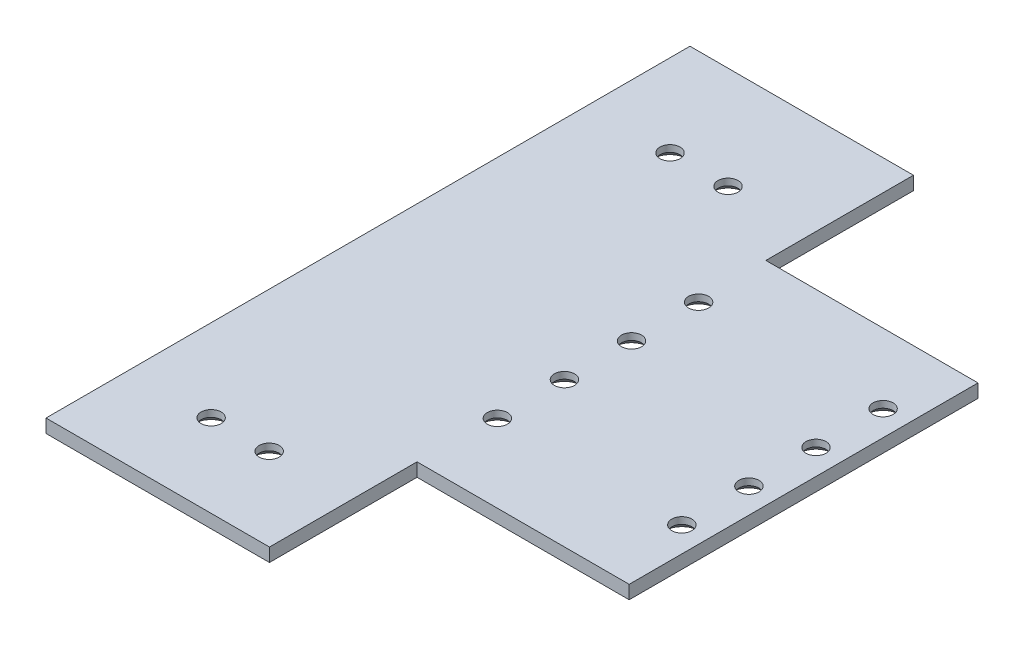
ISO-10303-21;
HEADER;
FILE_DESCRIPTION(('STEP AP214'),'2;1');
FILE_NAME('part.step','',(''),(''),'','','');
FILE_SCHEMA(('AUTOMOTIVE_DESIGN { 1 0 10303 214 1 1 1 1 }'));
ENDSEC;
DATA;
#1=APPLICATION_CONTEXT('core data for automotive mechanical design processes');
#2=APPLICATION_PROTOCOL_DEFINITION('international standard','automotive_design',2000,#1);
#3=PRODUCT_CONTEXT('',#1,'mechanical');
#4=PRODUCT('Part','Part','',(#3));
#5=PRODUCT_RELATED_PRODUCT_CATEGORY('part','',(#4));
#6=PRODUCT_DEFINITION_FORMATION('','',#4);
#7=PRODUCT_DEFINITION_CONTEXT('part definition',#1,'design');
#8=PRODUCT_DEFINITION('design','',#6,#7);
#9=PRODUCT_DEFINITION_SHAPE('','',#8);
#10=(LENGTH_UNIT() NAMED_UNIT(*) SI_UNIT(.MILLI.,.METRE.));
#11=(NAMED_UNIT(*) PLANE_ANGLE_UNIT() SI_UNIT($,.RADIAN.));
#12=(NAMED_UNIT(*) SI_UNIT($,.STERADIAN.) SOLID_ANGLE_UNIT());
#13=UNCERTAINTY_MEASURE_WITH_UNIT(LENGTH_MEASURE(1.E-05),#10,'distance_accuracy_value','');
#14=(GEOMETRIC_REPRESENTATION_CONTEXT(3) GLOBAL_UNCERTAINTY_ASSIGNED_CONTEXT((#13)) GLOBAL_UNIT_ASSIGNED_CONTEXT((#10,
#11,#12)) REPRESENTATION_CONTEXT('',''));
#15=CARTESIAN_POINT('',(0.,0.,0.));
#16=DIRECTION('',(0.,0.,1.));
#17=DIRECTION('',(1.,0.,0.));
#18=AXIS2_PLACEMENT_3D('',#15,#16,#17);
#19=CARTESIAN_POINT('',(0.,2.,0.));
#20=DIRECTION('',(0.,-1.,0.));
#21=DIRECTION('',(0.,0.,-1.));
#22=AXIS2_PLACEMENT_3D('',#19,#20,#21);
#23=PLANE('',#22);
#24=CARTESIAN_POINT('',(5.92356900920418,2.,35.6602207894241));
#25=DIRECTION('',(0.,1.,0.));
#26=DIRECTION('',(0.,0.,1.));
#27=AXIS2_PLACEMENT_3D('',#24,#25,#26);
#28=CIRCLE('',#27,1.5);
#29=CARTESIAN_POINT('',(5.92356900920418,2.,37.1602207894241));
#30=VERTEX_POINT('',#29);
#31=EDGE_CURVE('E350',#30,#30,#28,.T.);
#32=ORIENTED_EDGE('',*,*,#31,.F.);
#33=EDGE_LOOP('',(#32));
#34=FACE_BOUND('',#33,.T.);
#35=CARTESIAN_POINT('',(-2.72643099079582,2.,35.6602207894241));
#36=DIRECTION('',(0.,1.,0.));
#37=DIRECTION('',(0.,0.,1.));
#38=AXIS2_PLACEMENT_3D('',#35,#36,#37);
#39=CIRCLE('',#38,1.5);
#40=CARTESIAN_POINT('',(-2.72643099079582,2.,37.1602207894241));
#41=VERTEX_POINT('',#40);
#42=EDGE_CURVE('E348',#41,#41,#39,.T.);
#43=ORIENTED_EDGE('',*,*,#42,.F.);
#44=EDGE_LOOP('',(#43));
#45=FACE_BOUND('',#44,.T.);
#46=CARTESIAN_POINT('',(-2.72643099079582,2.,-32.7469767878305));
#47=DIRECTION('',(0.,1.,0.));
#48=DIRECTION('',(0.,0.,1.));
#49=AXIS2_PLACEMENT_3D('',#46,#47,#48);
#50=CIRCLE('',#49,1.5);
#51=CARTESIAN_POINT('',(-2.72643099079582,2.,-31.2469767878306));
#52=VERTEX_POINT('',#51);
#53=EDGE_CURVE('E349',#52,#52,#50,.T.);
#54=ORIENTED_EDGE('',*,*,#53,.F.);
#55=EDGE_LOOP('',(#54));
#56=FACE_BOUND('',#55,.T.);
#57=CARTESIAN_POINT('',(5.92356900920418,2.,-32.7469767878305));
#58=DIRECTION('',(0.,1.,0.));
#59=DIRECTION('',(0.,0.,1.));
#60=AXIS2_PLACEMENT_3D('',#57,#58,#59);
#61=CIRCLE('',#60,1.5);
#62=CARTESIAN_POINT('',(5.92356900920418,2.,-31.2469767878306));
#63=VERTEX_POINT('',#62);
#64=EDGE_CURVE('E353',#63,#63,#61,.T.);
#65=ORIENTED_EDGE('',*,*,#64,.F.);
#66=EDGE_LOOP('',(#65));
#67=FACE_BOUND('',#66,.T.);
#68=CARTESIAN_POINT('',(46.1837979810975,2.,-5.59999999995909));
#69=DIRECTION('',(0.,1.,0.));
#70=DIRECTION('',(0.,0.,1.));
#71=AXIS2_PLACEMENT_3D('',#68,#69,#70);
#72=CIRCLE('',#71,1.50000000001881);
#73=CARTESIAN_POINT('',(46.1837979810975,2.,-4.09999999994028));
#74=VERTEX_POINT('',#73);
#75=EDGE_CURVE('E369',#74,#74,#72,.T.);
#76=ORIENTED_EDGE('',*,*,#75,.F.);
#77=EDGE_LOOP('',(#76));
#78=FACE_BOUND('',#77,.T.);
#79=CARTESIAN_POINT('',(18.6837979810975,2.,4.40000000004091));
#80=DIRECTION('',(0.,1.,0.));
#81=DIRECTION('',(0.,0.,1.));
#82=AXIS2_PLACEMENT_3D('',#79,#80,#81);
#83=CIRCLE('',#82,1.50000000001833);
#84=CARTESIAN_POINT('',(18.6837979810975,2.,5.90000000005924));
#85=VERTEX_POINT('',#84);
#86=EDGE_CURVE('E372',#85,#85,#83,.T.);
#87=ORIENTED_EDGE('',*,*,#86,.F.);
#88=EDGE_LOOP('',(#87));
#89=FACE_BOUND('',#88,.T.);
#90=CARTESIAN_POINT('',(46.1837979810975,2.,4.40000000004091));
#91=DIRECTION('',(0.,1.,0.));
#92=DIRECTION('',(0.,0.,1.));
#93=AXIS2_PLACEMENT_3D('',#90,#91,#92);
#94=CIRCLE('',#93,1.50000000001881);
#95=CARTESIAN_POINT('',(46.1837979810975,2.,5.90000000005972));
#96=VERTEX_POINT('',#95);
#97=EDGE_CURVE('E375',#96,#96,#94,.T.);
#98=ORIENTED_EDGE('',*,*,#97,.F.);
#99=EDGE_LOOP('',(#98));
#100=FACE_BOUND('',#99,.T.);
#101=CARTESIAN_POINT('',(18.6837979810975,2.,14.4000000000409));
#102=DIRECTION('',(0.,1.,0.));
#103=DIRECTION('',(0.,0.,1.));
#104=AXIS2_PLACEMENT_3D('',#101,#102,#103);
#105=CIRCLE('',#104,1.50000000001833);
#106=CARTESIAN_POINT('',(18.6837979810975,2.,15.9000000000592));
#107=VERTEX_POINT('',#106);
#108=EDGE_CURVE('E378',#107,#107,#105,.T.);
#109=ORIENTED_EDGE('',*,*,#108,.F.);
#110=EDGE_LOOP('',(#109));
#111=FACE_BOUND('',#110,.T.);
#112=CARTESIAN_POINT('',(18.6837979810974,2.,-15.5999999999591));
#113=DIRECTION('',(0.,1.,0.));
#114=DIRECTION('',(0.,0.,1.));
#115=AXIS2_PLACEMENT_3D('',#112,#113,#114);
#116=CIRCLE('',#115,1.50000000001833);
#117=CARTESIAN_POINT('',(18.6837979810974,2.,-14.0999999999408));
#118=VERTEX_POINT('',#117);
#119=EDGE_CURVE('E362',#118,#118,#116,.T.);
#120=ORIENTED_EDGE('',*,*,#119,.F.);
#121=EDGE_LOOP('',(#120));
#122=FACE_BOUND('',#121,.T.);
#123=CARTESIAN_POINT('',(46.1837979810974,2.,-15.5999999999591));
#124=DIRECTION('',(0.,1.,0.));
#125=DIRECTION('',(0.,0.,1.));
#126=AXIS2_PLACEMENT_3D('',#123,#124,#125);
#127=CIRCLE('',#126,1.50000000001881);
#128=CARTESIAN_POINT('',(46.1837979810974,2.,-14.0999999999403));
#129=VERTEX_POINT('',#128);
#130=EDGE_CURVE('E365',#129,#129,#127,.T.);
#131=ORIENTED_EDGE('',*,*,#130,.F.);
#132=EDGE_LOOP('',(#131));
#133=FACE_BOUND('',#132,.T.);
#134=CARTESIAN_POINT('',(18.6837979810975,2.,-5.59999999995909));
#135=DIRECTION('',(0.,1.,0.));
#136=DIRECTION('',(0.,0.,1.));
#137=AXIS2_PLACEMENT_3D('',#134,#135,#136);
#138=CIRCLE('',#137,1.50000000001833);
#139=CARTESIAN_POINT('',(18.6837979810975,2.,-4.09999999994076));
#140=VERTEX_POINT('',#139);
#141=EDGE_CURVE('E366',#140,#140,#138,.T.);
#142=ORIENTED_EDGE('',*,*,#141,.F.);
#143=EDGE_LOOP('',(#142));
#144=FACE_BOUND('',#143,.T.);
#145=CARTESIAN_POINT('',(46.1837979810975,2.,14.4000000000409));
#146=DIRECTION('',(0.,1.,0.));
#147=DIRECTION('',(0.,0.,1.));
#148=AXIS2_PLACEMENT_3D('',#145,#146,#147);
#149=CIRCLE('',#148,1.50000000001881);
#150=CARTESIAN_POINT('',(46.1837979810975,2.,15.9000000000597));
#151=VERTEX_POINT('',#150);
#152=EDGE_CURVE('E142',#151,#151,#149,.T.);
#153=ORIENTED_EDGE('',*,*,#152,.F.);
#154=EDGE_LOOP('',(#153));
#155=FACE_BOUND('',#154,.T.);
#156=DIRECTION('',(-1.,0.,0.));
#157=VECTOR('',#156,1.);
#158=CARTESIAN_POINT('',(15.,2.,-47.999999999969));
#159=LINE('',#158,#157);
#160=CARTESIAN_POINT('',(18.309932440846,2.,-47.999999999969));
#161=VERTEX_POINT('',#160);
#162=CARTESIAN_POINT('',(-15.0020752239317,2.,-47.999999999969));
#163=VERTEX_POINT('',#162);
#164=EDGE_CURVE('E133',#161,#163,#159,.T.);
#165=ORIENTED_EDGE('',*,*,#164,.T.);
#166=DIRECTION('',(0.,0.,-1.));
#167=VECTOR('',#166,1.);
#168=CARTESIAN_POINT('',(-15.0020752239318,2.,-47.999999999969));
#169=LINE('',#168,#167);
#170=CARTESIAN_POINT('',(-15.0020752239317,2.,47.9999999999896));
#171=VERTEX_POINT('',#170);
#172=EDGE_CURVE('E55',#171,#163,#169,.T.);
#173=ORIENTED_EDGE('',*,*,#172,.F.);
#174=DIRECTION('',(1.,0.,1.61649475190916E-13));
#175=VECTOR('',#174,1.);
#176=CARTESIAN_POINT('',(-48.9590812442226,2.,48.000000000031));
#177=LINE('',#176,#175);
#178=CARTESIAN_POINT('',(18.309932440846,2.,48.0000000000413));
#179=VERTEX_POINT('',#178);
#180=EDGE_CURVE('E99',#171,#179,#177,.T.);
#181=ORIENTED_EDGE('',*,*,#180,.T.);
#182=DIRECTION('',(0.,0.,-1.));
#183=VECTOR('',#182,1.);
#184=CARTESIAN_POINT('',(18.309932440846,2.,26.0000000000413));
#185=LINE('',#184,#183);
#186=CARTESIAN_POINT('',(18.309932440846,2.,26.0000000000413));
#187=VERTEX_POINT('',#186);
#188=EDGE_CURVE('E386',#179,#187,#185,.T.);
#189=ORIENTED_EDGE('',*,*,#188,.T.);
#190=DIRECTION('',(1.,0.,0.));
#191=VECTOR('',#190,1.);
#192=CARTESIAN_POINT('',(49.9337979810974,2.,26.0000000000413));
#193=LINE('',#192,#191);
#194=CARTESIAN_POINT('',(49.9337979810974,2.,26.0000000000413));
#195=VERTEX_POINT('',#194);
#196=EDGE_CURVE('E115',#187,#195,#193,.T.);
#197=ORIENTED_EDGE('',*,*,#196,.T.);
#198=DIRECTION('',(0.,0.,-1.));
#199=VECTOR('',#198,1.);
#200=CARTESIAN_POINT('',(49.9337979810974,2.,-25.999999999969));
#201=LINE('',#200,#199);
#202=CARTESIAN_POINT('',(49.9337979810974,2.,-25.999999999969));
#203=VERTEX_POINT('',#202);
#204=EDGE_CURVE('E109',#195,#203,#201,.T.);
#205=ORIENTED_EDGE('',*,*,#204,.T.);
#206=DIRECTION('',(-1.,0.,0.));
#207=VECTOR('',#206,1.);
#208=CARTESIAN_POINT('',(49.9337979810974,2.,-25.999999999969));
#209=LINE('',#208,#207);
#210=CARTESIAN_POINT('',(18.309932440846,2.,-25.999999999969));
#211=VERTEX_POINT('',#210);
#212=EDGE_CURVE('E112',#203,#211,#209,.T.);
#213=ORIENTED_EDGE('',*,*,#212,.T.);
#214=DIRECTION('',(0.,0.,-1.));
#215=VECTOR('',#214,1.);
#216=CARTESIAN_POINT('',(18.309932440846,2.,-25.999999999969));
#217=LINE('',#216,#215);
#218=EDGE_CURVE('E64',#211,#161,#217,.T.);
#219=ORIENTED_EDGE('',*,*,#218,.T.);
#220=EDGE_LOOP('',(#165,#173,#181,#189,#197,#205,#213,#219));
#221=FACE_BOUND('',#220,.T.);
#222=ADVANCED_FACE('F39',(#34,#45,#56,#67,#78,#89,#100,#111,#122,#133,#144,#155,#221),#23,.F.);
#223=CARTESIAN_POINT('',(0.,0.,0.));
#224=DIRECTION('',(0.,-1.,0.));
#225=DIRECTION('',(0.,0.,-1.));
#226=AXIS2_PLACEMENT_3D('',#223,#224,#225);
#227=PLANE('',#226);
#228=CARTESIAN_POINT('',(-2.72643099079582,0.,35.6602207894241));
#229=DIRECTION('',(0.,-1.,0.));
#230=DIRECTION('',(0.,0.,-1.));
#231=AXIS2_PLACEMENT_3D('',#228,#229,#230);
#232=CIRCLE('',#231,2.50000000000002);
#233=CARTESIAN_POINT('',(-2.72643099079582,0.,33.1602207894241));
#234=VERTEX_POINT('',#233);
#235=EDGE_CURVE('E222',#234,#234,#232,.F.);
#236=ORIENTED_EDGE('',*,*,#235,.T.);
#237=EDGE_LOOP('',(#236));
#238=FACE_BOUND('',#237,.T.);
#239=CARTESIAN_POINT('',(5.92356900920418,0.,35.6602207894241));
#240=DIRECTION('',(0.,-1.,0.));
#241=DIRECTION('',(0.,0.,-1.));
#242=AXIS2_PLACEMENT_3D('',#239,#240,#241);
#243=CIRCLE('',#242,2.50000000000002);
#244=CARTESIAN_POINT('',(5.92356900920418,0.,33.1602207894241));
#245=VERTEX_POINT('',#244);
#246=EDGE_CURVE('E219',#245,#245,#243,.F.);
#247=ORIENTED_EDGE('',*,*,#246,.T.);
#248=EDGE_LOOP('',(#247));
#249=FACE_BOUND('',#248,.T.);
#250=CARTESIAN_POINT('',(-2.72643099079582,0.,-32.7469767878305));
#251=DIRECTION('',(0.,-1.,0.));
#252=DIRECTION('',(0.,0.,-1.));
#253=AXIS2_PLACEMENT_3D('',#250,#251,#252);
#254=CIRCLE('',#253,2.50000000000002);
#255=CARTESIAN_POINT('',(-2.72643099079582,0.,-35.2469767878306));
#256=VERTEX_POINT('',#255);
#257=EDGE_CURVE('E216',#256,#256,#254,.F.);
#258=ORIENTED_EDGE('',*,*,#257,.T.);
#259=EDGE_LOOP('',(#258));
#260=FACE_BOUND('',#259,.T.);
#261=CARTESIAN_POINT('',(5.92356900920418,0.,-32.7469767878305));
#262=DIRECTION('',(0.,-1.,0.));
#263=DIRECTION('',(0.,0.,-1.));
#264=AXIS2_PLACEMENT_3D('',#261,#262,#263);
#265=CIRCLE('',#264,2.50000000000002);
#266=CARTESIAN_POINT('',(5.92356900920418,0.,-35.2469767878306));
#267=VERTEX_POINT('',#266);
#268=EDGE_CURVE('E213',#267,#267,#265,.F.);
#269=ORIENTED_EDGE('',*,*,#268,.T.);
#270=EDGE_LOOP('',(#269));
#271=FACE_BOUND('',#270,.T.);
#272=DIRECTION('',(0.,0.,1.));
#273=VECTOR('',#272,1.);
#274=CARTESIAN_POINT('',(-15.0020752239317,0.,0.));
#275=LINE('',#274,#273);
#276=CARTESIAN_POINT('',(-15.0020752239318,0.,-47.999999999969));
#277=VERTEX_POINT('',#276);
#278=CARTESIAN_POINT('',(-15.0020752239317,0.,47.9999999999896));
#279=VERTEX_POINT('',#278);
#280=EDGE_CURVE('E356',#277,#279,#275,.T.);
#281=ORIENTED_EDGE('',*,*,#280,.F.);
#282=DIRECTION('',(-1.,0.,1.61866454352247E-13));
#283=VECTOR('',#282,1.);
#284=CARTESIAN_POINT('',(-48.9590812442226,0.,-47.9999999999586));
#285=LINE('',#284,#283);
#286=CARTESIAN_POINT('',(18.309932440846,0.,-47.999999999969));
#287=VERTEX_POINT('',#286);
#288=EDGE_CURVE('E92',#287,#277,#285,.T.);
#289=ORIENTED_EDGE('',*,*,#288,.F.);
#290=DIRECTION('',(0.,0.,-1.));
#291=VECTOR('',#290,1.);
#292=CARTESIAN_POINT('',(18.309932440846,0.,-25.999999999969));
#293=LINE('',#292,#291);
#294=CARTESIAN_POINT('',(18.309932440846,0.,-25.999999999969));
#295=VERTEX_POINT('',#294);
#296=EDGE_CURVE('E149',#295,#287,#293,.T.);
#297=ORIENTED_EDGE('',*,*,#296,.F.);
#298=DIRECTION('',(-1.,0.,0.));
#299=VECTOR('',#298,1.);
#300=CARTESIAN_POINT('',(49.9337979810974,0.,-25.999999999969));
#301=LINE('',#300,#299);
#302=CARTESIAN_POINT('',(49.9337979810974,0.,-25.999999999969));
#303=VERTEX_POINT('',#302);
#304=EDGE_CURVE('E147',#303,#295,#301,.T.);
#305=ORIENTED_EDGE('',*,*,#304,.F.);
#306=DIRECTION('',(0.,0.,-1.));
#307=VECTOR('',#306,1.);
#308=CARTESIAN_POINT('',(49.9337979810974,0.,-25.999999999969));
#309=LINE('',#308,#307);
#310=CARTESIAN_POINT('',(49.9337979810974,0.,26.0000000000413));
#311=VERTEX_POINT('',#310);
#312=EDGE_CURVE('E124',#311,#303,#309,.T.);
#313=ORIENTED_EDGE('',*,*,#312,.F.);
#314=DIRECTION('',(1.,0.,0.));
#315=VECTOR('',#314,1.);
#316=CARTESIAN_POINT('',(49.9337979810974,0.,26.0000000000413));
#317=LINE('',#316,#315);
#318=CARTESIAN_POINT('',(18.309932440846,0.,26.0000000000413));
#319=VERTEX_POINT('',#318);
#320=EDGE_CURVE('E144',#319,#311,#317,.T.);
#321=ORIENTED_EDGE('',*,*,#320,.F.);
#322=DIRECTION('',(0.,0.,-1.));
#323=VECTOR('',#322,1.);
#324=CARTESIAN_POINT('',(18.309932440846,0.,26.0000000000413));
#325=LINE('',#324,#323);
#326=CARTESIAN_POINT('',(18.309932440846,0.,48.0000000000413));
#327=VERTEX_POINT('',#326);
#328=EDGE_CURVE('E141',#327,#319,#325,.T.);
#329=ORIENTED_EDGE('',*,*,#328,.F.);
#330=DIRECTION('',(1.,0.,0.));
#331=VECTOR('',#330,1.);
#332=CARTESIAN_POINT('',(15.,0.,48.0000000000413));
#333=LINE('',#332,#331);
#334=EDGE_CURVE('E139',#279,#327,#333,.T.);
#335=ORIENTED_EDGE('',*,*,#334,.F.);
#336=EDGE_LOOP('',(#281,#289,#297,#305,#313,#321,#329,#335));
#337=FACE_BOUND('',#336,.T.);
#338=CARTESIAN_POINT('',(18.6837979810974,0.,-15.5999999999591));
#339=DIRECTION('',(0.,-1.,0.));
#340=DIRECTION('',(0.,0.,-1.));
#341=AXIS2_PLACEMENT_3D('',#338,#339,#340);
#342=CIRCLE('',#341,2.50000000001835);
#343=CARTESIAN_POINT('',(18.6837979810974,0.,-18.0999999999774));
#344=VERTEX_POINT('',#343);
#345=EDGE_CURVE('E186',#344,#344,#342,.F.);
#346=ORIENTED_EDGE('',*,*,#345,.T.);
#347=EDGE_LOOP('',(#346));
#348=FACE_BOUND('',#347,.T.);
#349=CARTESIAN_POINT('',(18.6837979810975,0.,-5.59999999995909));
#350=DIRECTION('',(0.,-1.,0.));
#351=DIRECTION('',(0.,0.,-1.));
#352=AXIS2_PLACEMENT_3D('',#349,#350,#351);
#353=CIRCLE('',#352,2.50000000001835);
#354=CARTESIAN_POINT('',(18.6837979810975,0.,-8.09999999997744));
#355=VERTEX_POINT('',#354);
#356=EDGE_CURVE('E183',#355,#355,#353,.F.);
#357=ORIENTED_EDGE('',*,*,#356,.T.);
#358=EDGE_LOOP('',(#357));
#359=FACE_BOUND('',#358,.T.);
#360=CARTESIAN_POINT('',(18.6837979810975,0.,4.40000000004091));
#361=DIRECTION('',(0.,-1.,0.));
#362=DIRECTION('',(0.,0.,-1.));
#363=AXIS2_PLACEMENT_3D('',#360,#361,#362);
#364=CIRCLE('',#363,2.50000000001835);
#365=CARTESIAN_POINT('',(18.6837979810975,0.,1.90000000002256));
#366=VERTEX_POINT('',#365);
#367=EDGE_CURVE('E180',#366,#366,#364,.F.);
#368=ORIENTED_EDGE('',*,*,#367,.T.);
#369=EDGE_LOOP('',(#368));
#370=FACE_BOUND('',#369,.T.);
#371=CARTESIAN_POINT('',(18.6837979810975,0.,14.4000000000409));
#372=DIRECTION('',(0.,-1.,0.));
#373=DIRECTION('',(0.,0.,-1.));
#374=AXIS2_PLACEMENT_3D('',#371,#372,#373);
#375=CIRCLE('',#374,2.50000000001835);
#376=CARTESIAN_POINT('',(18.6837979810975,0.,11.9000000000226));
#377=VERTEX_POINT('',#376);
#378=EDGE_CURVE('E177',#377,#377,#375,.F.);
#379=ORIENTED_EDGE('',*,*,#378,.T.);
#380=EDGE_LOOP('',(#379));
#381=FACE_BOUND('',#380,.T.);
#382=CARTESIAN_POINT('',(46.1837979810974,0.,-15.5999999999591));
#383=DIRECTION('',(0.,-1.,0.));
#384=DIRECTION('',(0.,0.,-1.));
#385=AXIS2_PLACEMENT_3D('',#382,#383,#384);
#386=CIRCLE('',#385,2.50000000001882);
#387=CARTESIAN_POINT('',(46.1837979810974,0.,-18.0999999999779));
#388=VERTEX_POINT('',#387);
#389=EDGE_CURVE('E174',#388,#388,#386,.F.);
#390=ORIENTED_EDGE('',*,*,#389,.T.);
#391=EDGE_LOOP('',(#390));
#392=FACE_BOUND('',#391,.T.);
#393=CARTESIAN_POINT('',(46.1837979810975,0.,-5.59999999995909));
#394=DIRECTION('',(0.,-1.,0.));
#395=DIRECTION('',(0.,0.,-1.));
#396=AXIS2_PLACEMENT_3D('',#393,#394,#395);
#397=CIRCLE('',#396,2.50000000001883);
#398=CARTESIAN_POINT('',(46.1837979810975,0.,-8.09999999997792));
#399=VERTEX_POINT('',#398);
#400=EDGE_CURVE('E171',#399,#399,#397,.F.);
#401=ORIENTED_EDGE('',*,*,#400,.T.);
#402=EDGE_LOOP('',(#401));
#403=FACE_BOUND('',#402,.T.);
#404=CARTESIAN_POINT('',(46.1837979810975,0.,4.40000000004091));
#405=DIRECTION('',(0.,-1.,0.));
#406=DIRECTION('',(0.,0.,-1.));
#407=AXIS2_PLACEMENT_3D('',#404,#405,#406);
#408=CIRCLE('',#407,2.50000000001882);
#409=CARTESIAN_POINT('',(46.1837979810975,0.,1.90000000002208));
#410=VERTEX_POINT('',#409);
#411=EDGE_CURVE('E168',#410,#410,#408,.F.);
#412=ORIENTED_EDGE('',*,*,#411,.T.);
#413=EDGE_LOOP('',(#412));
#414=FACE_BOUND('',#413,.T.);
#415=CARTESIAN_POINT('',(46.1837979810975,0.,14.4000000000409));
#416=DIRECTION('',(0.,-1.,0.));
#417=DIRECTION('',(0.,0.,-1.));
#418=AXIS2_PLACEMENT_3D('',#415,#416,#417);
#419=CIRCLE('',#418,2.50000000001882);
#420=CARTESIAN_POINT('',(46.1837979810975,0.,11.9000000000221));
#421=VERTEX_POINT('',#420);
#422=EDGE_CURVE('E165',#421,#421,#419,.F.);
#423=ORIENTED_EDGE('',*,*,#422,.T.);
#424=EDGE_LOOP('',(#423));
#425=FACE_BOUND('',#424,.T.);
#426=ADVANCED_FACE('F248',(#238,#249,#260,#271,#337,#348,#359,#370,#381,#392,#403,#414,#425),
#227,.T.);
#427=CARTESIAN_POINT('',(15.,2.,48.0000000000413));
#428=DIRECTION('',(0.,0.,-1.));
#429=DIRECTION('',(-1.,0.,0.));
#430=AXIS2_PLACEMENT_3D('',#427,#428,#429);
#431=PLANE('',#430);
#432=ORIENTED_EDGE('',*,*,#180,.F.);
#433=DIRECTION('',(0.,1.,0.));
#434=VECTOR('',#433,1.);
#435=CARTESIAN_POINT('',(-15.0020752239317,-8.,47.9999999999896));
#436=LINE('',#435,#434);
#437=EDGE_CURVE('E399',#279,#171,#436,.T.);
#438=ORIENTED_EDGE('',*,*,#437,.F.);
#439=ORIENTED_EDGE('',*,*,#334,.T.);
#440=DIRECTION('',(0.,-1.,0.));
#441=VECTOR('',#440,1.);
#442=CARTESIAN_POINT('',(18.309932440846,2.,48.0000000000413));
#443=LINE('',#442,#441);
#444=EDGE_CURVE('E159',#179,#327,#443,.T.);
#445=ORIENTED_EDGE('',*,*,#444,.F.);
#446=EDGE_LOOP('',(#432,#438,#439,#445));
#447=FACE_BOUND('',#446,.T.);
#448=ADVANCED_FACE('F254',(#447),#431,.F.);
#449=CARTESIAN_POINT('',(18.309932440846,2.,26.0000000000413));
#450=DIRECTION('',(-1.,0.,0.));
#451=DIRECTION('',(0.,0.,1.));
#452=AXIS2_PLACEMENT_3D('',#449,#450,#451);
#453=PLANE('',#452);
#454=ORIENTED_EDGE('',*,*,#328,.T.);
#455=DIRECTION('',(0.,-1.,0.));
#456=VECTOR('',#455,1.);
#457=CARTESIAN_POINT('',(18.309932440846,2.,26.0000000000413));
#458=LINE('',#457,#456);
#459=EDGE_CURVE('E156',#187,#319,#458,.T.);
#460=ORIENTED_EDGE('',*,*,#459,.F.);
#461=ORIENTED_EDGE('',*,*,#188,.F.);
#462=ORIENTED_EDGE('',*,*,#444,.T.);
#463=EDGE_LOOP('',(#454,#460,#461,#462));
#464=FACE_BOUND('',#463,.T.);
#465=ADVANCED_FACE('F278',(#464),#453,.F.);
#466=CARTESIAN_POINT('',(49.9337979810974,2.,26.0000000000413));
#467=DIRECTION('',(0.,0.,-1.));
#468=DIRECTION('',(-1.,0.,0.));
#469=AXIS2_PLACEMENT_3D('',#466,#467,#468);
#470=PLANE('',#469);
#471=ORIENTED_EDGE('',*,*,#320,.T.);
#472=DIRECTION('',(0.,-1.,0.));
#473=VECTOR('',#472,1.);
#474=CARTESIAN_POINT('',(49.9337979810974,2.,26.0000000000413));
#475=LINE('',#474,#473);
#476=EDGE_CURVE('E127',#195,#311,#475,.T.);
#477=ORIENTED_EDGE('',*,*,#476,.F.);
#478=ORIENTED_EDGE('',*,*,#196,.F.);
#479=ORIENTED_EDGE('',*,*,#459,.T.);
#480=EDGE_LOOP('',(#471,#477,#478,#479));
#481=FACE_BOUND('',#480,.T.);
#482=ADVANCED_FACE('F275',(#481),#470,.F.);
#483=CARTESIAN_POINT('',(49.9337979810974,2.,-25.999999999969));
#484=DIRECTION('',(-1.,0.,0.));
#485=DIRECTION('',(0.,0.,1.));
#486=AXIS2_PLACEMENT_3D('',#483,#484,#485);
#487=PLANE('',#486);
#488=ORIENTED_EDGE('',*,*,#312,.T.);
#489=DIRECTION('',(0.,-1.,0.));
#490=VECTOR('',#489,1.);
#491=CARTESIAN_POINT('',(49.9337979810974,2.,-25.999999999969));
#492=LINE('',#491,#490);
#493=EDGE_CURVE('E121',#203,#303,#492,.T.);
#494=ORIENTED_EDGE('',*,*,#493,.F.);
#495=ORIENTED_EDGE('',*,*,#204,.F.);
#496=ORIENTED_EDGE('',*,*,#476,.T.);
#497=EDGE_LOOP('',(#488,#494,#495,#496));
#498=FACE_BOUND('',#497,.T.);
#499=ADVANCED_FACE('F122',(#498),#487,.F.);
#500=CARTESIAN_POINT('',(49.9337979810974,2.,-25.999999999969));
#501=DIRECTION('',(0.,0.,1.));
#502=DIRECTION('',(1.,0.,0.));
#503=AXIS2_PLACEMENT_3D('',#500,#501,#502);
#504=PLANE('',#503);
#505=ORIENTED_EDGE('',*,*,#304,.T.);
#506=DIRECTION('',(0.,-1.,0.));
#507=VECTOR('',#506,1.);
#508=CARTESIAN_POINT('',(18.309932440846,2.,-25.999999999969));
#509=LINE('',#508,#507);
#510=EDGE_CURVE('E128',#211,#295,#509,.T.);
#511=ORIENTED_EDGE('',*,*,#510,.F.);
#512=ORIENTED_EDGE('',*,*,#212,.F.);
#513=ORIENTED_EDGE('',*,*,#493,.T.);
#514=EDGE_LOOP('',(#505,#511,#512,#513));
#515=FACE_BOUND('',#514,.T.);
#516=ADVANCED_FACE('F130',(#515),#504,.F.);
#517=CARTESIAN_POINT('',(18.309932440846,2.,-25.999999999969));
#518=DIRECTION('',(-1.,0.,0.));
#519=DIRECTION('',(0.,0.,1.));
#520=AXIS2_PLACEMENT_3D('',#517,#518,#519);
#521=PLANE('',#520);
#522=ORIENTED_EDGE('',*,*,#296,.T.);
#523=DIRECTION('',(0.,-1.,0.));
#524=VECTOR('',#523,1.);
#525=CARTESIAN_POINT('',(18.309932440846,2.,-47.999999999969));
#526=LINE('',#525,#524);
#527=EDGE_CURVE('E138',#161,#287,#526,.T.);
#528=ORIENTED_EDGE('',*,*,#527,.F.);
#529=ORIENTED_EDGE('',*,*,#218,.F.);
#530=ORIENTED_EDGE('',*,*,#510,.T.);
#531=EDGE_LOOP('',(#522,#528,#529,#530));
#532=FACE_BOUND('',#531,.T.);
#533=ADVANCED_FACE('F266',(#532),#521,.F.);
#534=CARTESIAN_POINT('',(-48.9590812442226,2.,-47.9999999999586));
#535=DIRECTION('',(1.61866454352247E-13,0.,1.));
#536=DIRECTION('',(1.,0.,-1.61866454352247E-13));
#537=AXIS2_PLACEMENT_3D('',#534,#535,#536);
#538=PLANE('',#537);
#539=ORIENTED_EDGE('',*,*,#288,.T.);
#540=DIRECTION('',(0.,1.,0.));
#541=VECTOR('',#540,1.);
#542=CARTESIAN_POINT('',(-15.0020752239318,-8.,-47.999999999969));
#543=LINE('',#542,#541);
#544=EDGE_CURVE('E393',#277,#163,#543,.T.);
#545=ORIENTED_EDGE('',*,*,#544,.T.);
#546=ORIENTED_EDGE('',*,*,#164,.F.);
#547=ORIENTED_EDGE('',*,*,#527,.T.);
#548=EDGE_LOOP('',(#539,#545,#546,#547));
#549=FACE_BOUND('',#548,.T.);
#550=ADVANCED_FACE('F263',(#549),#538,.F.);
#551=CARTESIAN_POINT('',(46.1837979810975,-8.,14.4000000000409));
#552=DIRECTION('',(0.,1.,0.));
#553=DIRECTION('',(0.,0.,1.));
#554=AXIS2_PLACEMENT_3D('',#551,#552,#553);
#555=CYLINDRICAL_SURFACE('',#554,1.50000000001881);
#556=CARTESIAN_POINT('',(46.1837979810975,1.00000000000001,14.4000000000409));
#557=DIRECTION('',(0.,-1.,0.));
#558=DIRECTION('',(0.,0.,-1.));
#559=AXIS2_PLACEMENT_3D('',#556,#557,#558);
#560=CIRCLE('',#559,1.50000000001881);
#561=CARTESIAN_POINT('',(46.1837979810975,1.00000000000001,12.9000000000221));
#562=VERTEX_POINT('',#561);
#563=EDGE_CURVE('E207',#562,#562,#560,.T.);
#564=ORIENTED_EDGE('',*,*,#563,.T.);
#565=EDGE_LOOP('',(#564));
#566=FACE_BOUND('',#565,.T.);
#567=ORIENTED_EDGE('',*,*,#152,.T.);
#568=EDGE_LOOP('',(#567));
#569=FACE_BOUND('',#568,.T.);
#570=ADVANCED_FACE('F260',(#566,#569),#555,.F.);
#571=CARTESIAN_POINT('',(18.6837979810975,-8.,-5.59999999995909));
#572=DIRECTION('',(0.,1.,0.));
#573=DIRECTION('',(0.,0.,1.));
#574=AXIS2_PLACEMENT_3D('',#571,#572,#573);
#575=CYLINDRICAL_SURFACE('',#574,1.50000000001833);
#576=CARTESIAN_POINT('',(18.6837979810975,1.00000000000001,-5.59999999995909));
#577=DIRECTION('',(0.,-1.,0.));
#578=DIRECTION('',(0.,0.,-1.));
#579=AXIS2_PLACEMENT_3D('',#576,#577,#578);
#580=CIRCLE('',#579,1.50000000001833);
#581=CARTESIAN_POINT('',(18.6837979810975,1.00000000000001,-7.09999999997742));
#582=VERTEX_POINT('',#581);
#583=EDGE_CURVE('E189',#582,#582,#580,.T.);
#584=ORIENTED_EDGE('',*,*,#583,.T.);
#585=EDGE_LOOP('',(#584));
#586=FACE_BOUND('',#585,.T.);
#587=ORIENTED_EDGE('',*,*,#141,.T.);
#588=EDGE_LOOP('',(#587));
#589=FACE_BOUND('',#588,.T.);
#590=ADVANCED_FACE('F424',(#586,#589),#575,.F.);
#591=CARTESIAN_POINT('',(46.1837979810974,-8.,-15.5999999999591));
#592=DIRECTION('',(0.,1.,0.));
#593=DIRECTION('',(0.,0.,1.));
#594=AXIS2_PLACEMENT_3D('',#591,#592,#593);
#595=CYLINDRICAL_SURFACE('',#594,1.50000000001881);
#596=CARTESIAN_POINT('',(46.1837979810974,1.00000000000001,-15.5999999999591));
#597=DIRECTION('',(0.,-1.,0.));
#598=DIRECTION('',(0.,0.,-1.));
#599=AXIS2_PLACEMENT_3D('',#596,#597,#598);
#600=CIRCLE('',#599,1.50000000001881);
#601=CARTESIAN_POINT('',(46.1837979810974,1.00000000000001,-17.0999999999779));
#602=VERTEX_POINT('',#601);
#603=EDGE_CURVE('E198',#602,#602,#600,.T.);
#604=ORIENTED_EDGE('',*,*,#603,.T.);
#605=EDGE_LOOP('',(#604));
#606=FACE_BOUND('',#605,.T.);
#607=ORIENTED_EDGE('',*,*,#130,.T.);
#608=EDGE_LOOP('',(#607));
#609=FACE_BOUND('',#608,.T.);
#610=ADVANCED_FACE('F430',(#606,#609),#595,.F.);
#611=CARTESIAN_POINT('',(18.6837979810974,-8.,-15.5999999999591));
#612=DIRECTION('',(0.,1.,0.));
#613=DIRECTION('',(0.,0.,1.));
#614=AXIS2_PLACEMENT_3D('',#611,#612,#613);
#615=CYLINDRICAL_SURFACE('',#614,1.50000000001833);
#616=CARTESIAN_POINT('',(18.6837979810974,1.00000000000001,-15.5999999999591));
#617=DIRECTION('',(0.,-1.,0.));
#618=DIRECTION('',(0.,0.,-1.));
#619=AXIS2_PLACEMENT_3D('',#616,#617,#618);
#620=CIRCLE('',#619,1.50000000001833);
#621=CARTESIAN_POINT('',(18.6837979810974,1.00000000000001,-17.0999999999774));
#622=VERTEX_POINT('',#621);
#623=EDGE_CURVE('E162',#622,#622,#620,.T.);
#624=ORIENTED_EDGE('',*,*,#623,.T.);
#625=EDGE_LOOP('',(#624));
#626=FACE_BOUND('',#625,.T.);
#627=ORIENTED_EDGE('',*,*,#119,.T.);
#628=EDGE_LOOP('',(#627));
#629=FACE_BOUND('',#628,.T.);
#630=ADVANCED_FACE('F436',(#626,#629),#615,.F.);
#631=CARTESIAN_POINT('',(18.6837979810975,-8.,14.4000000000409));
#632=DIRECTION('',(0.,1.,0.));
#633=DIRECTION('',(0.,0.,1.));
#634=AXIS2_PLACEMENT_3D('',#631,#632,#633);
#635=CYLINDRICAL_SURFACE('',#634,1.50000000001833);
#636=CARTESIAN_POINT('',(18.6837979810975,1.00000000000001,14.4000000000409));
#637=DIRECTION('',(0.,-1.,0.));
#638=DIRECTION('',(0.,0.,-1.));
#639=AXIS2_PLACEMENT_3D('',#636,#637,#638);
#640=CIRCLE('',#639,1.50000000001833);
#641=CARTESIAN_POINT('',(18.6837979810975,1.00000000000001,12.9000000000226));
#642=VERTEX_POINT('',#641);
#643=EDGE_CURVE('E195',#642,#642,#640,.T.);
#644=ORIENTED_EDGE('',*,*,#643,.T.);
#645=EDGE_LOOP('',(#644));
#646=FACE_BOUND('',#645,.T.);
#647=ORIENTED_EDGE('',*,*,#108,.T.);
#648=EDGE_LOOP('',(#647));
#649=FACE_BOUND('',#648,.T.);
#650=ADVANCED_FACE('F451',(#646,#649),#635,.F.);
#651=CARTESIAN_POINT('',(46.1837979810975,-8.,4.40000000004091));
#652=DIRECTION('',(0.,1.,0.));
#653=DIRECTION('',(0.,0.,1.));
#654=AXIS2_PLACEMENT_3D('',#651,#652,#653);
#655=CYLINDRICAL_SURFACE('',#654,1.50000000001881);
#656=CARTESIAN_POINT('',(46.1837979810975,1.00000000000001,4.40000000004091));
#657=DIRECTION('',(0.,-1.,0.));
#658=DIRECTION('',(0.,0.,-1.));
#659=AXIS2_PLACEMENT_3D('',#656,#657,#658);
#660=CIRCLE('',#659,1.50000000001881);
#661=CARTESIAN_POINT('',(46.1837979810975,1.00000000000001,2.9000000000221));
#662=VERTEX_POINT('',#661);
#663=EDGE_CURVE('E204',#662,#662,#660,.T.);
#664=ORIENTED_EDGE('',*,*,#663,.T.);
#665=EDGE_LOOP('',(#664));
#666=FACE_BOUND('',#665,.T.);
#667=ORIENTED_EDGE('',*,*,#97,.T.);
#668=EDGE_LOOP('',(#667));
#669=FACE_BOUND('',#668,.T.);
#670=ADVANCED_FACE('F446',(#666,#669),#655,.F.);
#671=CARTESIAN_POINT('',(18.6837979810975,-8.,4.40000000004091));
#672=DIRECTION('',(0.,1.,0.));
#673=DIRECTION('',(0.,0.,1.));
#674=AXIS2_PLACEMENT_3D('',#671,#672,#673);
#675=CYLINDRICAL_SURFACE('',#674,1.50000000001833);
#676=CARTESIAN_POINT('',(18.6837979810975,1.00000000000001,4.40000000004091));
#677=DIRECTION('',(0.,-1.,0.));
#678=DIRECTION('',(0.,0.,-1.));
#679=AXIS2_PLACEMENT_3D('',#676,#677,#678);
#680=CIRCLE('',#679,1.50000000001833);
#681=CARTESIAN_POINT('',(18.6837979810975,1.00000000000001,2.90000000002258));
#682=VERTEX_POINT('',#681);
#683=EDGE_CURVE('E192',#682,#682,#680,.T.);
#684=ORIENTED_EDGE('',*,*,#683,.T.);
#685=EDGE_LOOP('',(#684));
#686=FACE_BOUND('',#685,.T.);
#687=ORIENTED_EDGE('',*,*,#86,.T.);
#688=EDGE_LOOP('',(#687));
#689=FACE_BOUND('',#688,.T.);
#690=ADVANCED_FACE('F443',(#686,#689),#675,.F.);
#691=CARTESIAN_POINT('',(46.1837979810975,-8.,-5.59999999995909));
#692=DIRECTION('',(0.,1.,0.));
#693=DIRECTION('',(0.,0.,1.));
#694=AXIS2_PLACEMENT_3D('',#691,#692,#693);
#695=CYLINDRICAL_SURFACE('',#694,1.50000000001881);
#696=CARTESIAN_POINT('',(46.1837979810975,1.00000000000001,-5.59999999995909));
#697=DIRECTION('',(0.,-1.,0.));
#698=DIRECTION('',(0.,0.,-1.));
#699=AXIS2_PLACEMENT_3D('',#696,#697,#698);
#700=CIRCLE('',#699,1.50000000001881);
#701=CARTESIAN_POINT('',(46.1837979810975,1.00000000000001,-7.0999999999779));
#702=VERTEX_POINT('',#701);
#703=EDGE_CURVE('E201',#702,#702,#700,.T.);
#704=ORIENTED_EDGE('',*,*,#703,.T.);
#705=EDGE_LOOP('',(#704));
#706=FACE_BOUND('',#705,.T.);
#707=ORIENTED_EDGE('',*,*,#75,.T.);
#708=EDGE_LOOP('',(#707));
#709=FACE_BOUND('',#708,.T.);
#710=ADVANCED_FACE('F290',(#706,#709),#695,.F.);
#711=CARTESIAN_POINT('',(18.6837979810974,1.00000000000001,-15.5999999999591));
#712=DIRECTION('',(0.,-1.,0.));
#713=DIRECTION('',(0.,0.,-1.));
#714=AXIS2_PLACEMENT_3D('',#711,#712,#713);
#715=CONICAL_SURFACE('',#714,1.50000000001833,0.785398163397453);
#716=ORIENTED_EDGE('',*,*,#345,.F.);
#717=EDGE_LOOP('',(#716));
#718=FACE_BOUND('',#717,.T.);
#719=ORIENTED_EDGE('',*,*,#623,.F.);
#720=EDGE_LOOP('',(#719));
#721=FACE_BOUND('',#720,.T.);
#722=ADVANCED_FACE('F286',(#718,#721),#715,.F.);
#723=CARTESIAN_POINT('',(18.6837979810975,1.00000000000001,-5.59999999995909));
#724=DIRECTION('',(0.,-1.,0.));
#725=DIRECTION('',(0.,0.,-1.));
#726=AXIS2_PLACEMENT_3D('',#723,#724,#725);
#727=CONICAL_SURFACE('',#726,1.50000000001833,0.785398163397453);
#728=ORIENTED_EDGE('',*,*,#356,.F.);
#729=EDGE_LOOP('',(#728));
#730=FACE_BOUND('',#729,.T.);
#731=ORIENTED_EDGE('',*,*,#583,.F.);
#732=EDGE_LOOP('',(#731));
#733=FACE_BOUND('',#732,.T.);
#734=ADVANCED_FACE('F289',(#730,#733),#727,.F.);
#735=CARTESIAN_POINT('',(18.6837979810975,1.00000000000001,4.40000000004091));
#736=DIRECTION('',(0.,-1.,0.));
#737=DIRECTION('',(0.,0.,-1.));
#738=AXIS2_PLACEMENT_3D('',#735,#736,#737);
#739=CONICAL_SURFACE('',#738,1.50000000001833,0.785398163397453);
#740=ORIENTED_EDGE('',*,*,#367,.F.);
#741=EDGE_LOOP('',(#740));
#742=FACE_BOUND('',#741,.T.);
#743=ORIENTED_EDGE('',*,*,#683,.F.);
#744=EDGE_LOOP('',(#743));
#745=FACE_BOUND('',#744,.T.);
#746=ADVANCED_FACE('F294',(#742,#745),#739,.F.);
#747=CARTESIAN_POINT('',(18.6837979810975,1.00000000000001,14.4000000000409));
#748=DIRECTION('',(0.,-1.,0.));
#749=DIRECTION('',(0.,0.,-1.));
#750=AXIS2_PLACEMENT_3D('',#747,#748,#749);
#751=CONICAL_SURFACE('',#750,1.50000000001833,0.785398163397453);
#752=ORIENTED_EDGE('',*,*,#378,.F.);
#753=EDGE_LOOP('',(#752));
#754=FACE_BOUND('',#753,.T.);
#755=ORIENTED_EDGE('',*,*,#643,.F.);
#756=EDGE_LOOP('',(#755));
#757=FACE_BOUND('',#756,.T.);
#758=ADVANCED_FACE('F298',(#754,#757),#751,.F.);
#759=CARTESIAN_POINT('',(46.1837979810974,1.00000000000001,-15.5999999999591));
#760=DIRECTION('',(0.,-1.,0.));
#761=DIRECTION('',(0.,0.,-1.));
#762=AXIS2_PLACEMENT_3D('',#759,#760,#761);
#763=CONICAL_SURFACE('',#762,1.50000000001881,0.785398163397453);
#764=ORIENTED_EDGE('',*,*,#389,.F.);
#765=EDGE_LOOP('',(#764));
#766=FACE_BOUND('',#765,.T.);
#767=ORIENTED_EDGE('',*,*,#603,.F.);
#768=EDGE_LOOP('',(#767));
#769=FACE_BOUND('',#768,.T.);
#770=ADVANCED_FACE('F302',(#766,#769),#763,.F.);
#771=CARTESIAN_POINT('',(46.1837979810975,1.00000000000001,-5.59999999995909));
#772=DIRECTION('',(0.,-1.,0.));
#773=DIRECTION('',(0.,0.,-1.));
#774=AXIS2_PLACEMENT_3D('',#771,#772,#773);
#775=CONICAL_SURFACE('',#774,1.50000000001881,0.785398163397453);
#776=ORIENTED_EDGE('',*,*,#400,.F.);
#777=EDGE_LOOP('',(#776));
#778=FACE_BOUND('',#777,.T.);
#779=ORIENTED_EDGE('',*,*,#703,.F.);
#780=EDGE_LOOP('',(#779));
#781=FACE_BOUND('',#780,.T.);
#782=ADVANCED_FACE('F306',(#778,#781),#775,.F.);
#783=CARTESIAN_POINT('',(46.1837979810975,1.00000000000001,4.40000000004091));
#784=DIRECTION('',(0.,-1.,0.));
#785=DIRECTION('',(0.,0.,-1.));
#786=AXIS2_PLACEMENT_3D('',#783,#784,#785);
#787=CONICAL_SURFACE('',#786,1.50000000001881,0.785398163397453);
#788=ORIENTED_EDGE('',*,*,#411,.F.);
#789=EDGE_LOOP('',(#788));
#790=FACE_BOUND('',#789,.T.);
#791=ORIENTED_EDGE('',*,*,#663,.F.);
#792=EDGE_LOOP('',(#791));
#793=FACE_BOUND('',#792,.T.);
#794=ADVANCED_FACE('F310',(#790,#793),#787,.F.);
#795=CARTESIAN_POINT('',(46.1837979810975,1.00000000000001,14.4000000000409));
#796=DIRECTION('',(0.,-1.,0.));
#797=DIRECTION('',(0.,0.,-1.));
#798=AXIS2_PLACEMENT_3D('',#795,#796,#797);
#799=CONICAL_SURFACE('',#798,1.50000000001881,0.785398163397453);
#800=ORIENTED_EDGE('',*,*,#422,.F.);
#801=EDGE_LOOP('',(#800));
#802=FACE_BOUND('',#801,.T.);
#803=ORIENTED_EDGE('',*,*,#563,.F.);
#804=EDGE_LOOP('',(#803));
#805=FACE_BOUND('',#804,.T.);
#806=ADVANCED_FACE('F314',(#802,#805),#799,.F.);
#807=CARTESIAN_POINT('',(5.92356900920418,-8.,-32.7469767878305));
#808=DIRECTION('',(0.,1.,0.));
#809=DIRECTION('',(0.,0.,1.));
#810=AXIS2_PLACEMENT_3D('',#807,#808,#809);
#811=CYLINDRICAL_SURFACE('',#810,1.5);
#812=CARTESIAN_POINT('',(5.92356900920418,1.00000000000001,-32.7469767878305));
#813=DIRECTION('',(0.,-1.,0.));
#814=DIRECTION('',(0.,0.,-1.));
#815=AXIS2_PLACEMENT_3D('',#812,#813,#814);
#816=CIRCLE('',#815,1.5);
#817=CARTESIAN_POINT('',(5.92356900920418,1.00000000000001,-34.2469767878305));
#818=VERTEX_POINT('',#817);
#819=EDGE_CURVE('E11',#818,#818,#816,.T.);
#820=ORIENTED_EDGE('',*,*,#819,.T.);
#821=EDGE_LOOP('',(#820));
#822=FACE_BOUND('',#821,.T.);
#823=ORIENTED_EDGE('',*,*,#64,.T.);
#824=EDGE_LOOP('',(#823));
#825=FACE_BOUND('',#824,.T.);
#826=ADVANCED_FACE('F318',(#822,#825),#811,.F.);
#827=CARTESIAN_POINT('',(-2.72643099079582,-8.,-32.7469767878305));
#828=DIRECTION('',(0.,1.,0.));
#829=DIRECTION('',(0.,0.,1.));
#830=AXIS2_PLACEMENT_3D('',#827,#828,#829);
#831=CYLINDRICAL_SURFACE('',#830,1.5);
#832=CARTESIAN_POINT('',(-2.72643099079582,1.00000000000001,-32.7469767878305));
#833=DIRECTION('',(0.,-1.,0.));
#834=DIRECTION('',(0.,0.,-1.));
#835=AXIS2_PLACEMENT_3D('',#832,#833,#834);
#836=CIRCLE('',#835,1.5);
#837=CARTESIAN_POINT('',(-2.72643099079582,1.00000000000001,-34.2469767878305));
#838=VERTEX_POINT('',#837);
#839=EDGE_CURVE('E48',#838,#838,#836,.T.);
#840=ORIENTED_EDGE('',*,*,#839,.T.);
#841=EDGE_LOOP('',(#840));
#842=FACE_BOUND('',#841,.T.);
#843=ORIENTED_EDGE('',*,*,#53,.T.);
#844=EDGE_LOOP('',(#843));
#845=FACE_BOUND('',#844,.T.);
#846=ADVANCED_FACE('F230',(#842,#845),#831,.F.);
#847=CARTESIAN_POINT('',(-2.72643099079582,-8.,35.6602207894241));
#848=DIRECTION('',(0.,1.,0.));
#849=DIRECTION('',(0.,0.,1.));
#850=AXIS2_PLACEMENT_3D('',#847,#848,#849);
#851=CYLINDRICAL_SURFACE('',#850,1.5);
#852=CARTESIAN_POINT('',(-2.72643099079582,1.00000000000001,35.6602207894241));
#853=DIRECTION('',(0.,-1.,0.));
#854=DIRECTION('',(0.,0.,-1.));
#855=AXIS2_PLACEMENT_3D('',#852,#853,#854);
#856=CIRCLE('',#855,1.5);
#857=CARTESIAN_POINT('',(-2.72643099079582,1.00000000000001,34.1602207894241));
#858=VERTEX_POINT('',#857);
#859=EDGE_CURVE('E210',#858,#858,#856,.T.);
#860=ORIENTED_EDGE('',*,*,#859,.T.);
#861=EDGE_LOOP('',(#860));
#862=FACE_BOUND('',#861,.T.);
#863=ORIENTED_EDGE('',*,*,#42,.T.);
#864=EDGE_LOOP('',(#863));
#865=FACE_BOUND('',#864,.T.);
#866=ADVANCED_FACE('F342',(#862,#865),#851,.F.);
#867=CARTESIAN_POINT('',(5.92356900920418,-8.,35.6602207894241));
#868=DIRECTION('',(0.,1.,0.));
#869=DIRECTION('',(0.,0.,1.));
#870=AXIS2_PLACEMENT_3D('',#867,#868,#869);
#871=CYLINDRICAL_SURFACE('',#870,1.5);
#872=CARTESIAN_POINT('',(5.92356900920418,1.00000000000001,35.6602207894241));
#873=DIRECTION('',(0.,-1.,0.));
#874=DIRECTION('',(0.,0.,-1.));
#875=AXIS2_PLACEMENT_3D('',#872,#873,#874);
#876=CIRCLE('',#875,1.5);
#877=CARTESIAN_POINT('',(5.92356900920418,1.00000000000001,34.1602207894241));
#878=VERTEX_POINT('',#877);
#879=EDGE_CURVE('E225',#878,#878,#876,.T.);
#880=ORIENTED_EDGE('',*,*,#879,.T.);
#881=EDGE_LOOP('',(#880));
#882=FACE_BOUND('',#881,.T.);
#883=ORIENTED_EDGE('',*,*,#31,.T.);
#884=EDGE_LOOP('',(#883));
#885=FACE_BOUND('',#884,.T.);
#886=ADVANCED_FACE('F336',(#882,#885),#871,.F.);
#887=CARTESIAN_POINT('',(-15.0020752239318,-8.,-47.999999999969));
#888=DIRECTION('',(1.,0.,0.));
#889=DIRECTION('',(0.,0.,-1.));
#890=AXIS2_PLACEMENT_3D('',#887,#888,#889);
#891=PLANE('',#890);
#892=ORIENTED_EDGE('',*,*,#280,.T.);
#893=ORIENTED_EDGE('',*,*,#437,.T.);
#894=ORIENTED_EDGE('',*,*,#172,.T.);
#895=ORIENTED_EDGE('',*,*,#544,.F.);
#896=EDGE_LOOP('',(#892,#893,#894,#895));
#897=FACE_BOUND('',#896,.T.);
#898=ADVANCED_FACE('F325',(#897),#891,.F.);
#899=CARTESIAN_POINT('',(-2.72643099079582,1.00000000000001,35.6602207894241));
#900=DIRECTION('',(0.,-1.,0.));
#901=DIRECTION('',(0.,0.,-1.));
#902=AXIS2_PLACEMENT_3D('',#899,#900,#901);
#903=CONICAL_SURFACE('',#902,1.5,0.785398163397453);
#904=ORIENTED_EDGE('',*,*,#235,.F.);
#905=EDGE_LOOP('',(#904));
#906=FACE_BOUND('',#905,.T.);
#907=ORIENTED_EDGE('',*,*,#859,.F.);
#908=EDGE_LOOP('',(#907));
#909=FACE_BOUND('',#908,.T.);
#910=ADVANCED_FACE('F242',(#906,#909),#903,.F.);
#911=CARTESIAN_POINT('',(5.92356900920418,1.00000000000001,35.6602207894241));
#912=DIRECTION('',(0.,-1.,0.));
#913=DIRECTION('',(0.,0.,-1.));
#914=AXIS2_PLACEMENT_3D('',#911,#912,#913);
#915=CONICAL_SURFACE('',#914,1.5,0.785398163397453);
#916=ORIENTED_EDGE('',*,*,#246,.F.);
#917=EDGE_LOOP('',(#916));
#918=FACE_BOUND('',#917,.T.);
#919=ORIENTED_EDGE('',*,*,#879,.F.);
#920=EDGE_LOOP('',(#919));
#921=FACE_BOUND('',#920,.T.);
#922=ADVANCED_FACE('F235',(#918,#921),#915,.F.);
#923=CARTESIAN_POINT('',(-2.72643099079582,1.00000000000001,-32.7469767878305));
#924=DIRECTION('',(0.,-1.,0.));
#925=DIRECTION('',(0.,0.,-1.));
#926=AXIS2_PLACEMENT_3D('',#923,#924,#925);
#927=CONICAL_SURFACE('',#926,1.5,0.785398163397452);
#928=ORIENTED_EDGE('',*,*,#257,.F.);
#929=EDGE_LOOP('',(#928));
#930=FACE_BOUND('',#929,.T.);
#931=ORIENTED_EDGE('',*,*,#839,.F.);
#932=EDGE_LOOP('',(#931));
#933=FACE_BOUND('',#932,.T.);
#934=ADVANCED_FACE('F233',(#930,#933),#927,.F.);
#935=CARTESIAN_POINT('',(5.92356900920418,1.00000000000001,-32.7469767878305));
#936=DIRECTION('',(0.,-1.,0.));
#937=DIRECTION('',(0.,0.,-1.));
#938=AXIS2_PLACEMENT_3D('',#935,#936,#937);
#939=CONICAL_SURFACE('',#938,1.5,0.785398163397452);
#940=ORIENTED_EDGE('',*,*,#268,.F.);
#941=EDGE_LOOP('',(#940));
#942=FACE_BOUND('',#941,.T.);
#943=ORIENTED_EDGE('',*,*,#819,.F.);
#944=EDGE_LOOP('',(#943));
#945=FACE_BOUND('',#944,.T.);
#946=ADVANCED_FACE('F42',(#942,#945),#939,.F.);
#947=CLOSED_SHELL('',(#222,#426,#448,#465,#482,#499,#516,#533,#550,#570,#590,#610,#630,#650,
#670,#690,#710,#722,#734,#746,#758,#770,#782,#794,#806,#826,#846,#866,#886,#898,#910,#922,#934,#946));
#948=MANIFOLD_SOLID_BREP('B2',#947);
#949=ADVANCED_BREP_SHAPE_REPRESENTATION('',(#18,#948),#14);
#950=SHAPE_DEFINITION_REPRESENTATION(#9,#949);
ENDSEC;
END-ISO-10303-21;
